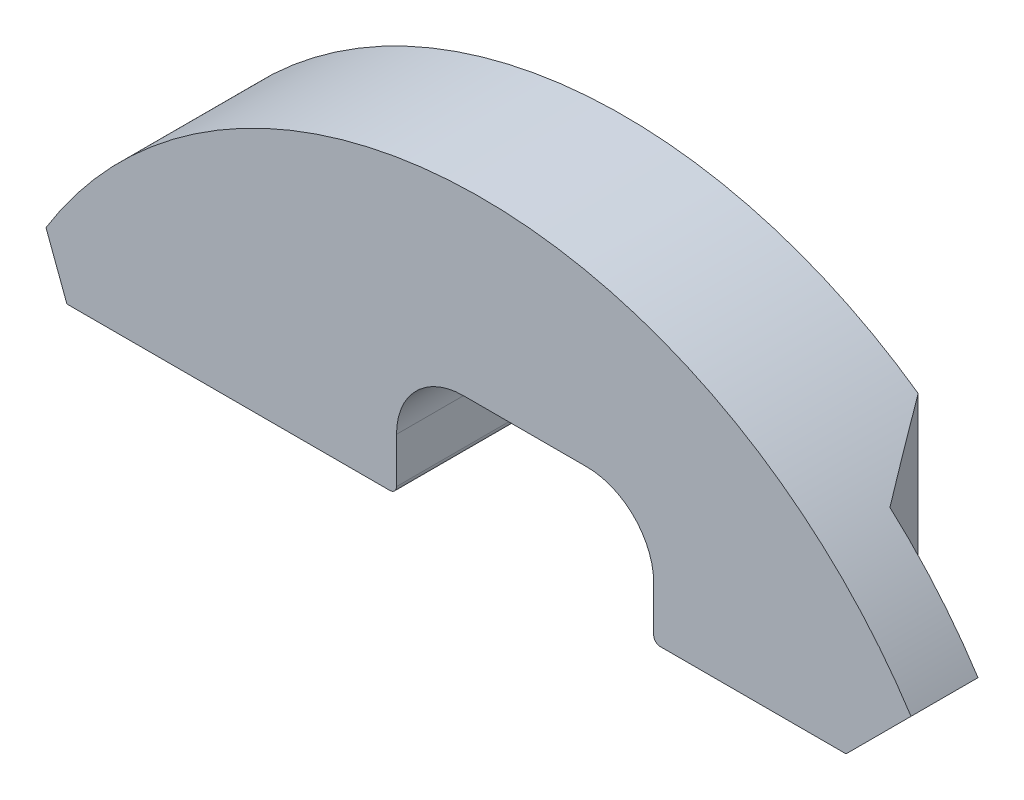
ISO-10303-21;
HEADER;
FILE_DESCRIPTION(('STEP AP214'),'2;1');
FILE_NAME('part.step','',(''),(''),'','','');
FILE_SCHEMA(('AUTOMOTIVE_DESIGN { 1 0 10303 214 1 1 1 1 }'));
ENDSEC;
DATA;
#1=APPLICATION_CONTEXT('core data for automotive mechanical design processes');
#2=APPLICATION_PROTOCOL_DEFINITION('international standard','automotive_design',2000,#1);
#3=PRODUCT_CONTEXT('',#1,'mechanical');
#4=PRODUCT('Part','Part','',(#3));
#5=PRODUCT_RELATED_PRODUCT_CATEGORY('part','',(#4));
#6=PRODUCT_DEFINITION_FORMATION('','',#4);
#7=PRODUCT_DEFINITION_CONTEXT('part definition',#1,'design');
#8=PRODUCT_DEFINITION('design','',#6,#7);
#9=PRODUCT_DEFINITION_SHAPE('','',#8);
#10=(LENGTH_UNIT() NAMED_UNIT(*) SI_UNIT(.MILLI.,.METRE.));
#11=(NAMED_UNIT(*) PLANE_ANGLE_UNIT() SI_UNIT($,.RADIAN.));
#12=(NAMED_UNIT(*) SI_UNIT($,.STERADIAN.) SOLID_ANGLE_UNIT());
#13=UNCERTAINTY_MEASURE_WITH_UNIT(LENGTH_MEASURE(1.E-05),#10,'distance_accuracy_value','');
#14=(GEOMETRIC_REPRESENTATION_CONTEXT(3) GLOBAL_UNCERTAINTY_ASSIGNED_CONTEXT((#13)) GLOBAL_UNIT_ASSIGNED_CONTEXT((#10,
#11,#12)) REPRESENTATION_CONTEXT('',''));
#15=CARTESIAN_POINT('',(0.,0.,0.));
#16=DIRECTION('',(0.,0.,1.));
#17=DIRECTION('',(1.,0.,0.));
#18=AXIS2_PLACEMENT_3D('',#15,#16,#17);
#19=CARTESIAN_POINT('',(48.768,0.,53.975));
#20=DIRECTION('',(0.,1.,0.));
#21=DIRECTION('',(-1.,0.,0.));
#22=AXIS2_PLACEMENT_3D('',#19,#20,#21);
#23=PLANE('',#22);
#24=DIRECTION('',(0.529998940003187,0.,0.847998304005083));
#25=VECTOR('',#24,1.);
#26=CARTESIAN_POINT('',(112.968558118522,0.,28.575000000001));
#27=LINE('',#26,#25);
#28=CARTESIAN_POINT('',(95.109183118521,0.,0.));
#29=VERTEX_POINT('',#28);
#30=CARTESIAN_POINT('',(112.968558118522,0.,28.575000000001));
#31=VERTEX_POINT('',#30);
#32=EDGE_CURVE('E140',#29,#31,#27,.T.);
#33=ORIENTED_EDGE('',*,*,#32,.T.);
#34=DIRECTION('',(1.,0.,0.));
#35=VECTOR('',#34,1.);
#36=CARTESIAN_POINT('',(163.768558118521,0.,28.575000000001));
#37=LINE('',#36,#35);
#38=CARTESIAN_POINT('',(121.717162921738,0.,28.575000000001));
#39=VERTEX_POINT('',#38);
#40=EDGE_CURVE('E143',#31,#39,#37,.T.);
#41=ORIENTED_EDGE('',*,*,#40,.T.);
#42=DIRECTION('',(0.,0.,1.));
#43=VECTOR('',#42,1.);
#44=CARTESIAN_POINT('',(121.717162921738,0.,53.975));
#45=LINE('',#44,#43);
#46=CARTESIAN_POINT('',(121.717162921738,0.,53.975));
#47=VERTEX_POINT('',#46);
#48=EDGE_CURVE('E228',#39,#47,#45,.T.);
#49=ORIENTED_EDGE('',*,*,#48,.T.);
#50=DIRECTION('',(1.,0.,0.));
#51=VECTOR('',#50,1.);
#52=CARTESIAN_POINT('',(48.768,0.,53.975));
#53=LINE('',#52,#51);
#54=CARTESIAN_POINT('',(51.308,0.,53.975));
#55=VERTEX_POINT('',#54);
#56=EDGE_CURVE('E170',#55,#47,#53,.T.);
#57=ORIENTED_EDGE('',*,*,#56,.F.);
#58=DIRECTION('',(0.,0.,-1.));
#59=VECTOR('',#58,1.);
#60=CARTESIAN_POINT('',(51.308,0.,53.975));
#61=LINE('',#60,#59);
#62=CARTESIAN_POINT('',(51.308,0.,0.));
#63=VERTEX_POINT('',#62);
#64=EDGE_CURVE('E221',#55,#63,#61,.T.);
#65=ORIENTED_EDGE('',*,*,#64,.T.);
#66=DIRECTION('',(1.,0.,0.));
#67=VECTOR('',#66,1.);
#68=CARTESIAN_POINT('',(48.768,0.,0.));
#69=LINE('',#68,#67);
#70=EDGE_CURVE('E153',#63,#29,#69,.T.);
#71=ORIENTED_EDGE('',*,*,#70,.T.);
#72=EDGE_LOOP('',(#33,#41,#49,#57,#65,#71));
#73=FACE_BOUND('',#72,.T.);
#74=ADVANCED_FACE('F34',(#73),#23,.F.);
#75=CARTESIAN_POINT('',(-16.5714418814787,-80.3119244999138,53.975));
#76=DIRECTION('',(0.,0.,-1.));
#77=DIRECTION('',(-1.,0.,0.));
#78=AXIS2_PLACEMENT_3D('',#75,#76,#77);
#79=CYLINDRICAL_SURFACE('',#78,193.811622771456);
#80=CARTESIAN_POINT('',(-16.5714418814787,-80.3119244999138,-178.688999999996));
#81=DIRECTION('',(0.847998304005083,0.,-0.529998940003187));
#82=DIRECTION('',(-0.529998940003187,0.,-0.847998304005083));
#83=AXIS2_PLACEMENT_3D('',#80,#81,#82);
#84=ELLIPSE('',#83,365.683038479833,193.811622771456);
#85=CARTESIAN_POINT('',(95.109183118521,78.0875171686561,0.));
#86=VERTEX_POINT('',#85);
#87=CARTESIAN_POINT('',(112.968558118522,63.848866012989,28.575000000001));
#88=VERTEX_POINT('',#87);
#89=EDGE_CURVE('E142',#86,#88,#84,.T.);
#90=ORIENTED_EDGE('',*,*,#89,.F.);
#91=CARTESIAN_POINT('',(-16.5714418814787,-80.3119244999138,0.));
#92=DIRECTION('',(0.,0.,1.));
#93=DIRECTION('',(-1.,0.,0.));
#94=AXIS2_PLACEMENT_3D('',#91,#92,#93);
#95=CIRCLE('',#94,193.811622771456);
#96=CARTESIAN_POINT('',(-181.700318552196,21.1543221576439,0.));
#97=VERTEX_POINT('',#96);
#98=EDGE_CURVE('E162',#86,#97,#95,.T.);
#99=ORIENTED_EDGE('',*,*,#98,.T.);
#100=DIRECTION('',(0.,0.,-1.));
#101=VECTOR('',#100,1.);
#102=CARTESIAN_POINT('',(-181.700318552196,21.1543221576439,53.975));
#103=LINE('',#102,#101);
#104=CARTESIAN_POINT('',(-181.700318552196,21.1543221576439,53.975));
#105=VERTEX_POINT('',#104);
#106=EDGE_CURVE('E58',#97,#105,#103,.F.);
#107=ORIENTED_EDGE('',*,*,#106,.T.);
#108=CARTESIAN_POINT('',(-16.5714418814787,-80.3119244999138,53.975));
#109=DIRECTION('',(0.,0.,1.));
#110=DIRECTION('',(-1.,0.,0.));
#111=AXIS2_PLACEMENT_3D('',#108,#109,#110);
#112=CIRCLE('',#111,193.811622771456);
#113=CARTESIAN_POINT('',(146.361471493222,24.6443085714839,53.975));
#114=VERTEX_POINT('',#113);
#115=EDGE_CURVE('E173',#114,#105,#112,.T.);
#116=ORIENTED_EDGE('',*,*,#115,.F.);
#117=DIRECTION('',(0.,0.,-1.));
#118=VECTOR('',#117,1.);
#119=CARTESIAN_POINT('',(146.361471493222,24.6443085714839,53.975));
#120=LINE('',#119,#118);
#121=CARTESIAN_POINT('',(146.361471493222,24.6443085714839,28.575000000001));
#122=VERTEX_POINT('',#121);
#123=EDGE_CURVE('E225',#114,#122,#120,.T.);
#124=ORIENTED_EDGE('',*,*,#123,.T.);
#125=CARTESIAN_POINT('',(-16.5714418814787,-80.3119244999138,28.575000000001));
#126=DIRECTION('',(0.,0.,-1.));
#127=DIRECTION('',(-1.,0.,0.));
#128=AXIS2_PLACEMENT_3D('',#125,#126,#127);
#129=CIRCLE('',#128,193.811622771456);
#130=EDGE_CURVE('E50',#88,#122,#129,.T.);
#131=ORIENTED_EDGE('',*,*,#130,.F.);
#132=EDGE_LOOP('',(#90,#99,#107,#116,#124,#131));
#133=FACE_BOUND('',#132,.T.);
#134=ADVANCED_FACE('F244',(#133),#79,.T.);
#135=CARTESIAN_POINT('',(-16.5714418814787,-80.3119244999138,0.));
#136=DIRECTION('',(0.,0.,-1.));
#137=DIRECTION('',(-1.,0.,0.));
#138=AXIS2_PLACEMENT_3D('',#135,#136,#137);
#139=PLANE('',#138);
#140=ORIENTED_EDGE('',*,*,#98,.F.);
#141=DIRECTION('',(0.,-1.,0.));
#142=VECTOR('',#141,1.);
#143=CARTESIAN_POINT('',(95.109183118521,-80.3119244999138,0.));
#144=LINE('',#143,#142);
#145=EDGE_CURVE('E11',#86,#29,#144,.T.);
#146=ORIENTED_EDGE('',*,*,#145,.T.);
#147=ORIENTED_EDGE('',*,*,#70,.F.);
#148=CARTESIAN_POINT('',(51.308,2.54,0.));
#149=DIRECTION('',(0.,0.,-1.));
#150=DIRECTION('',(-1.,0.,0.));
#151=AXIS2_PLACEMENT_3D('',#148,#149,#150);
#152=CIRCLE('',#151,2.54);
#153=CARTESIAN_POINT('',(48.768,2.54,0.));
#154=VERTEX_POINT('',#153);
#155=EDGE_CURVE('E209',#63,#154,#152,.T.);
#156=ORIENTED_EDGE('',*,*,#155,.T.);
#157=DIRECTION('',(0.,-1.,0.));
#158=VECTOR('',#157,1.);
#159=CARTESIAN_POINT('',(48.768,0.,0.));
#160=LINE('',#159,#158);
#161=CARTESIAN_POINT('',(48.768,19.706,0.));
#162=VERTEX_POINT('',#161);
#163=EDGE_CURVE('E182',#162,#154,#160,.T.);
#164=ORIENTED_EDGE('',*,*,#163,.F.);
#165=CARTESIAN_POINT('',(23.368,19.706,0.));
#166=DIRECTION('',(0.,0.,-1.));
#167=DIRECTION('',(-1.,0.,0.));
#168=AXIS2_PLACEMENT_3D('',#165,#166,#167);
#169=CIRCLE('',#168,25.4);
#170=CARTESIAN_POINT('',(23.368,45.1060000000001,0.));
#171=VERTEX_POINT('',#170);
#172=EDGE_CURVE('E197',#162,#171,#169,.F.);
#173=ORIENTED_EDGE('',*,*,#172,.T.);
#174=DIRECTION('',(1.,0.,0.));
#175=VECTOR('',#174,1.);
#176=CARTESIAN_POINT('',(-48.768,45.1060000000001,0.));
#177=LINE('',#176,#175);
#178=CARTESIAN_POINT('',(-23.368,45.1060000000001,0.));
#179=VERTEX_POINT('',#178);
#180=EDGE_CURVE('E179',#179,#171,#177,.T.);
#181=ORIENTED_EDGE('',*,*,#180,.F.);
#182=CARTESIAN_POINT('',(-23.368,19.706,0.));
#183=DIRECTION('',(0.,0.,-1.));
#184=DIRECTION('',(-1.,0.,0.));
#185=AXIS2_PLACEMENT_3D('',#182,#183,#184);
#186=CIRCLE('',#185,25.4);
#187=CARTESIAN_POINT('',(-48.768,19.706,0.));
#188=VERTEX_POINT('',#187);
#189=EDGE_CURVE('E201',#179,#188,#186,.F.);
#190=ORIENTED_EDGE('',*,*,#189,.T.);
#191=DIRECTION('',(0.,1.,0.));
#192=VECTOR('',#191,1.);
#193=CARTESIAN_POINT('',(-48.768,0.,0.));
#194=LINE('',#193,#192);
#195=CARTESIAN_POINT('',(-48.768,2.54,0.));
#196=VERTEX_POINT('',#195);
#197=EDGE_CURVE('E177',#196,#188,#194,.T.);
#198=ORIENTED_EDGE('',*,*,#197,.F.);
#199=CARTESIAN_POINT('',(-51.308,2.54,0.));
#200=DIRECTION('',(0.,0.,-1.));
#201=DIRECTION('',(-1.,0.,0.));
#202=AXIS2_PLACEMENT_3D('',#199,#200,#201);
#203=CIRCLE('',#202,2.54);
#204=CARTESIAN_POINT('',(-51.308,0.,0.));
#205=VERTEX_POINT('',#204);
#206=EDGE_CURVE('E211',#196,#205,#203,.T.);
#207=ORIENTED_EDGE('',*,*,#206,.T.);
#208=DIRECTION('',(1.,0.,0.));
#209=VECTOR('',#208,1.);
#210=CARTESIAN_POINT('',(-48.768,0.,0.));
#211=LINE('',#210,#209);
#212=CARTESIAN_POINT('',(-173.782777234729,0.,0.));
#213=VERTEX_POINT('',#212);
#214=EDGE_CURVE('E158',#213,#205,#211,.T.);
#215=ORIENTED_EDGE('',*,*,#214,.F.);
#216=DIRECTION('',(0.350528369686415,-0.936552113897024,0.));
#217=VECTOR('',#216,1.);
#218=CARTESIAN_POINT('',(-128.100750825996,-122.054595576595,0.));
#219=LINE('',#218,#217);
#220=EDGE_CURVE('E235',#213,#97,#219,.F.);
#221=ORIENTED_EDGE('',*,*,#220,.T.);
#222=EDGE_LOOP('',(#140,#146,#147,#156,#164,#173,#181,#190,#198,#207,#215,#221));
#223=FACE_BOUND('',#222,.T.);
#224=ADVANCED_FACE('F256',(#223),#139,.T.);
#225=CARTESIAN_POINT('',(146.361471493222,24.6443085714839,53.975));
#226=DIRECTION('',(-0.707106781186546,0.707106781186549,0.));
#227=DIRECTION('',(0.,0.,-1.));
#228=AXIS2_PLACEMENT_3D('',#225,#226,#227);
#229=PLANE('',#228);
#230=ORIENTED_EDGE('',*,*,#48,.F.);
#231=DIRECTION('',(-0.707106781186549,-0.707106781186546,0.));
#232=VECTOR('',#231,1.);
#233=CARTESIAN_POINT('',(146.361471493222,24.6443085714839,28.575000000001));
#234=LINE('',#233,#232);
#235=EDGE_CURVE('E43',#39,#122,#234,.F.);
#236=ORIENTED_EDGE('',*,*,#235,.T.);
#237=ORIENTED_EDGE('',*,*,#123,.F.);
#238=DIRECTION('',(-0.707106781186549,-0.707106781186546,0.));
#239=VECTOR('',#238,1.);
#240=CARTESIAN_POINT('',(146.361471493222,24.6443085714839,53.975));
#241=LINE('',#240,#239);
#242=EDGE_CURVE('E230',#47,#114,#241,.F.);
#243=ORIENTED_EDGE('',*,*,#242,.F.);
#244=EDGE_LOOP('',(#230,#236,#237,#243));
#245=FACE_BOUND('',#244,.T.);
#246=ADVANCED_FACE('F242',(#245),#229,.F.);
#247=CARTESIAN_POINT('',(-48.768,0.,53.975));
#248=DIRECTION('',(0.,1.,0.));
#249=DIRECTION('',(-1.,0.,0.));
#250=AXIS2_PLACEMENT_3D('',#247,#248,#249);
#251=PLANE('',#250);
#252=DIRECTION('',(1.,0.,0.));
#253=VECTOR('',#252,1.);
#254=CARTESIAN_POINT('',(-48.768,0.,53.975));
#255=LINE('',#254,#253);
#256=CARTESIAN_POINT('',(-173.782777234729,0.,53.975));
#257=VERTEX_POINT('',#256);
#258=CARTESIAN_POINT('',(-51.308,0.,53.975));
#259=VERTEX_POINT('',#258);
#260=EDGE_CURVE('E159',#257,#259,#255,.T.);
#261=ORIENTED_EDGE('',*,*,#260,.F.);
#262=DIRECTION('',(0.,0.,-1.));
#263=VECTOR('',#262,1.);
#264=CARTESIAN_POINT('',(-173.782777234729,0.,53.975));
#265=LINE('',#264,#263);
#266=EDGE_CURVE('E232',#257,#213,#265,.T.);
#267=ORIENTED_EDGE('',*,*,#266,.T.);
#268=ORIENTED_EDGE('',*,*,#214,.T.);
#269=DIRECTION('',(0.,0.,-1.));
#270=VECTOR('',#269,1.);
#271=CARTESIAN_POINT('',(-51.308,0.,53.975));
#272=LINE('',#271,#270);
#273=EDGE_CURVE('E214',#205,#259,#272,.F.);
#274=ORIENTED_EDGE('',*,*,#273,.T.);
#275=EDGE_LOOP('',(#261,#267,#268,#274));
#276=FACE_BOUND('',#275,.T.);
#277=ADVANCED_FACE('F253',(#276),#251,.F.);
#278=CARTESIAN_POINT('',(-48.768,0.,53.975));
#279=DIRECTION('',(-1.,0.,0.));
#280=DIRECTION('',(0.,0.,1.));
#281=AXIS2_PLACEMENT_3D('',#278,#279,#280);
#282=PLANE('',#281);
#283=DIRECTION('',(0.,1.,0.));
#284=VECTOR('',#283,1.);
#285=CARTESIAN_POINT('',(-48.768,0.,53.975));
#286=LINE('',#285,#284);
#287=CARTESIAN_POINT('',(-48.768,2.54,53.975));
#288=VERTEX_POINT('',#287);
#289=CARTESIAN_POINT('',(-48.768,19.706,53.975));
#290=VERTEX_POINT('',#289);
#291=EDGE_CURVE('E161',#288,#290,#286,.T.);
#292=ORIENTED_EDGE('',*,*,#291,.F.);
#293=DIRECTION('',(0.,0.,-1.));
#294=VECTOR('',#293,1.);
#295=CARTESIAN_POINT('',(-48.768,2.54,53.975));
#296=LINE('',#295,#294);
#297=EDGE_CURVE('E206',#288,#196,#296,.T.);
#298=ORIENTED_EDGE('',*,*,#297,.T.);
#299=ORIENTED_EDGE('',*,*,#197,.T.);
#300=DIRECTION('',(0.,0.,-1.));
#301=VECTOR('',#300,1.);
#302=CARTESIAN_POINT('',(-48.768,19.706,53.975));
#303=LINE('',#302,#301);
#304=EDGE_CURVE('E194',#188,#290,#303,.F.);
#305=ORIENTED_EDGE('',*,*,#304,.T.);
#306=EDGE_LOOP('',(#292,#298,#299,#305));
#307=FACE_BOUND('',#306,.T.);
#308=ADVANCED_FACE('F265',(#307),#282,.F.);
#309=CARTESIAN_POINT('',(-48.768,45.1060000000001,53.975));
#310=DIRECTION('',(0.,1.,0.));
#311=DIRECTION('',(0.,0.,1.));
#312=AXIS2_PLACEMENT_3D('',#309,#310,#311);
#313=PLANE('',#312);
#314=ORIENTED_EDGE('',*,*,#180,.T.);
#315=DIRECTION('',(0.,0.,-1.));
#316=VECTOR('',#315,1.);
#317=CARTESIAN_POINT('',(23.368,45.1060000000001,53.975));
#318=LINE('',#317,#316);
#319=CARTESIAN_POINT('',(23.368,45.1060000000001,53.975));
#320=VERTEX_POINT('',#319);
#321=EDGE_CURVE('E192',#171,#320,#318,.F.);
#322=ORIENTED_EDGE('',*,*,#321,.T.);
#323=DIRECTION('',(1.,0.,0.));
#324=VECTOR('',#323,1.);
#325=CARTESIAN_POINT('',(-48.768,45.1060000000001,53.975));
#326=LINE('',#325,#324);
#327=CARTESIAN_POINT('',(-23.368,45.1060000000001,53.975));
#328=VERTEX_POINT('',#327);
#329=EDGE_CURVE('E164',#328,#320,#326,.T.);
#330=ORIENTED_EDGE('',*,*,#329,.F.);
#331=DIRECTION('',(0.,0.,-1.));
#332=VECTOR('',#331,1.);
#333=CARTESIAN_POINT('',(-23.368,45.1060000000001,0.));
#334=LINE('',#333,#332);
#335=EDGE_CURVE('E189',#328,#179,#334,.T.);
#336=ORIENTED_EDGE('',*,*,#335,.T.);
#337=EDGE_LOOP('',(#314,#322,#330,#336));
#338=FACE_BOUND('',#337,.T.);
#339=ADVANCED_FACE('F274',(#338),#313,.F.);
#340=CARTESIAN_POINT('',(48.768,0.,53.975));
#341=DIRECTION('',(1.,0.,0.));
#342=DIRECTION('',(0.,0.,-1.));
#343=AXIS2_PLACEMENT_3D('',#340,#341,#342);
#344=PLANE('',#343);
#345=ORIENTED_EDGE('',*,*,#163,.T.);
#346=DIRECTION('',(0.,0.,-1.));
#347=VECTOR('',#346,1.);
#348=CARTESIAN_POINT('',(48.768,2.54,53.975));
#349=LINE('',#348,#347);
#350=CARTESIAN_POINT('',(48.768,2.54,53.975));
#351=VERTEX_POINT('',#350);
#352=EDGE_CURVE('E223',#154,#351,#349,.F.);
#353=ORIENTED_EDGE('',*,*,#352,.T.);
#354=DIRECTION('',(0.,-1.,0.));
#355=VECTOR('',#354,1.);
#356=CARTESIAN_POINT('',(48.768,0.,53.975));
#357=LINE('',#356,#355);
#358=CARTESIAN_POINT('',(48.768,19.706,53.975));
#359=VERTEX_POINT('',#358);
#360=EDGE_CURVE('E167',#359,#351,#357,.T.);
#361=ORIENTED_EDGE('',*,*,#360,.F.);
#362=DIRECTION('',(0.,0.,-1.));
#363=VECTOR('',#362,1.);
#364=CARTESIAN_POINT('',(48.768,19.706,0.));
#365=LINE('',#364,#363);
#366=EDGE_CURVE('E175',#359,#162,#365,.T.);
#367=ORIENTED_EDGE('',*,*,#366,.T.);
#368=EDGE_LOOP('',(#345,#353,#361,#367));
#369=FACE_BOUND('',#368,.T.);
#370=ADVANCED_FACE('F283',(#369),#344,.F.);
#371=CARTESIAN_POINT('',(-16.5714418814787,-80.3119244999138,53.975));
#372=DIRECTION('',(0.,0.,-1.));
#373=DIRECTION('',(-1.,0.,0.));
#374=AXIS2_PLACEMENT_3D('',#371,#372,#373);
#375=PLANE('',#374);
#376=ORIENTED_EDGE('',*,*,#115,.T.);
#377=DIRECTION('',(-0.350528369686415,0.936552113897024,0.));
#378=VECTOR('',#377,1.);
#379=CARTESIAN_POINT('',(-173.782777234729,0.,53.975));
#380=LINE('',#379,#378);
#381=EDGE_CURVE('E239',#105,#257,#380,.F.);
#382=ORIENTED_EDGE('',*,*,#381,.T.);
#383=ORIENTED_EDGE('',*,*,#260,.T.);
#384=CARTESIAN_POINT('',(-51.308,2.54,53.975));
#385=DIRECTION('',(0.,0.,-1.));
#386=DIRECTION('',(-1.,0.,0.));
#387=AXIS2_PLACEMENT_3D('',#384,#385,#386);
#388=CIRCLE('',#387,2.54);
#389=EDGE_CURVE('E219',#259,#288,#388,.F.);
#390=ORIENTED_EDGE('',*,*,#389,.T.);
#391=ORIENTED_EDGE('',*,*,#291,.T.);
#392=CARTESIAN_POINT('',(-23.368,19.706,53.975));
#393=DIRECTION('',(0.,0.,-1.));
#394=DIRECTION('',(-1.,0.,0.));
#395=AXIS2_PLACEMENT_3D('',#392,#393,#394);
#396=CIRCLE('',#395,25.4);
#397=EDGE_CURVE('E204',#290,#328,#396,.T.);
#398=ORIENTED_EDGE('',*,*,#397,.T.);
#399=ORIENTED_EDGE('',*,*,#329,.T.);
#400=CARTESIAN_POINT('',(23.368,19.706,53.975));
#401=DIRECTION('',(0.,0.,-1.));
#402=DIRECTION('',(-1.,0.,0.));
#403=AXIS2_PLACEMENT_3D('',#400,#401,#402);
#404=CIRCLE('',#403,25.4);
#405=EDGE_CURVE('E199',#320,#359,#404,.T.);
#406=ORIENTED_EDGE('',*,*,#405,.T.);
#407=ORIENTED_EDGE('',*,*,#360,.T.);
#408=CARTESIAN_POINT('',(51.308,2.54,53.975));
#409=DIRECTION('',(0.,0.,-1.));
#410=DIRECTION('',(-1.,0.,0.));
#411=AXIS2_PLACEMENT_3D('',#408,#409,#410);
#412=CIRCLE('',#411,2.54);
#413=EDGE_CURVE('E217',#351,#55,#412,.F.);
#414=ORIENTED_EDGE('',*,*,#413,.T.);
#415=ORIENTED_EDGE('',*,*,#56,.T.);
#416=ORIENTED_EDGE('',*,*,#242,.T.);
#417=EDGE_LOOP('',(#376,#382,#383,#390,#391,#398,#399,#406,#407,#414,#415,#416));
#418=FACE_BOUND('',#417,.T.);
#419=ADVANCED_FACE('F247',(#418),#375,.F.);
#420=CARTESIAN_POINT('',(23.368,19.706,53.975));
#421=DIRECTION('',(0.,0.,1.));
#422=DIRECTION('',(1.,0.,0.));
#423=AXIS2_PLACEMENT_3D('',#420,#421,#422);
#424=CYLINDRICAL_SURFACE('',#423,25.4);
#425=ORIENTED_EDGE('',*,*,#405,.F.);
#426=ORIENTED_EDGE('',*,*,#321,.F.);
#427=ORIENTED_EDGE('',*,*,#172,.F.);
#428=ORIENTED_EDGE('',*,*,#366,.F.);
#429=EDGE_LOOP('',(#425,#426,#427,#428));
#430=FACE_BOUND('',#429,.T.);
#431=ADVANCED_FACE('F278',(#430),#424,.F.);
#432=CARTESIAN_POINT('',(-23.368,19.706,53.975));
#433=DIRECTION('',(0.,0.,1.));
#434=DIRECTION('',(1.,0.,0.));
#435=AXIS2_PLACEMENT_3D('',#432,#433,#434);
#436=CYLINDRICAL_SURFACE('',#435,25.4);
#437=ORIENTED_EDGE('',*,*,#397,.F.);
#438=ORIENTED_EDGE('',*,*,#304,.F.);
#439=ORIENTED_EDGE('',*,*,#189,.F.);
#440=ORIENTED_EDGE('',*,*,#335,.F.);
#441=EDGE_LOOP('',(#437,#438,#439,#440));
#442=FACE_BOUND('',#441,.T.);
#443=ADVANCED_FACE('F270',(#442),#436,.F.);
#444=CARTESIAN_POINT('',(-51.308,2.54,53.975));
#445=DIRECTION('',(0.,0.,-1.));
#446=DIRECTION('',(-1.,0.,0.));
#447=AXIS2_PLACEMENT_3D('',#444,#445,#446);
#448=CYLINDRICAL_SURFACE('',#447,2.54);
#449=ORIENTED_EDGE('',*,*,#389,.F.);
#450=ORIENTED_EDGE('',*,*,#273,.F.);
#451=ORIENTED_EDGE('',*,*,#206,.F.);
#452=ORIENTED_EDGE('',*,*,#297,.F.);
#453=EDGE_LOOP('',(#449,#450,#451,#452));
#454=FACE_BOUND('',#453,.T.);
#455=ADVANCED_FACE('F262',(#454),#448,.T.);
#456=CARTESIAN_POINT('',(51.308,2.54,53.975));
#457=DIRECTION('',(0.,0.,-1.));
#458=DIRECTION('',(-1.,0.,0.));
#459=AXIS2_PLACEMENT_3D('',#456,#457,#458);
#460=CYLINDRICAL_SURFACE('',#459,2.54);
#461=ORIENTED_EDGE('',*,*,#413,.F.);
#462=ORIENTED_EDGE('',*,*,#352,.F.);
#463=ORIENTED_EDGE('',*,*,#155,.F.);
#464=ORIENTED_EDGE('',*,*,#64,.F.);
#465=EDGE_LOOP('',(#461,#462,#463,#464));
#466=FACE_BOUND('',#465,.T.);
#467=ADVANCED_FACE('F287',(#466),#460,.T.);
#468=CARTESIAN_POINT('',(-173.782777234729,0.,53.975));
#469=DIRECTION('',(0.936552113897024,0.350528369686415,0.));
#470=DIRECTION('',(0.,0.,-1.));
#471=AXIS2_PLACEMENT_3D('',#468,#469,#470);
#472=PLANE('',#471);
#473=ORIENTED_EDGE('',*,*,#381,.F.);
#474=ORIENTED_EDGE('',*,*,#106,.F.);
#475=ORIENTED_EDGE('',*,*,#220,.F.);
#476=ORIENTED_EDGE('',*,*,#266,.F.);
#477=EDGE_LOOP('',(#473,#474,#475,#476));
#478=FACE_BOUND('',#477,.T.);
#479=ADVANCED_FACE('F37',(#478),#472,.F.);
#480=CARTESIAN_POINT('',(112.968558118522,113.499698271542,28.575000000001));
#481=DIRECTION('',(0.847998304005083,0.,-0.529998940003187));
#482=DIRECTION('',(-0.529998940003187,0.,-0.847998304005083));
#483=AXIS2_PLACEMENT_3D('',#480,#481,#482);
#484=PLANE('',#483);
#485=ORIENTED_EDGE('',*,*,#89,.T.);
#486=DIRECTION('',(0.,-1.,0.));
#487=VECTOR('',#486,1.);
#488=CARTESIAN_POINT('',(112.968558118522,113.499698271542,28.575000000001));
#489=LINE('',#488,#487);
#490=EDGE_CURVE('E136',#88,#31,#489,.T.);
#491=ORIENTED_EDGE('',*,*,#490,.T.);
#492=ORIENTED_EDGE('',*,*,#32,.F.);
#493=ORIENTED_EDGE('',*,*,#145,.F.);
#494=EDGE_LOOP('',(#485,#491,#492,#493));
#495=FACE_BOUND('',#494,.T.);
#496=ADVANCED_FACE('F138',(#495),#484,.T.);
#497=CARTESIAN_POINT('',(163.768558118521,113.499698271542,28.575000000001));
#498=DIRECTION('',(0.,0.,-1.));
#499=DIRECTION('',(-1.,0.,0.));
#500=AXIS2_PLACEMENT_3D('',#497,#498,#499);
#501=PLANE('',#500);
#502=ORIENTED_EDGE('',*,*,#130,.T.);
#503=ORIENTED_EDGE('',*,*,#235,.F.);
#504=ORIENTED_EDGE('',*,*,#40,.F.);
#505=ORIENTED_EDGE('',*,*,#490,.F.);
#506=EDGE_LOOP('',(#502,#503,#504,#505));
#507=FACE_BOUND('',#506,.T.);
#508=ADVANCED_FACE('F146',(#507),#501,.T.);
#509=CLOSED_SHELL('',(#74,#134,#224,#246,#277,#308,#339,#370,#419,#431,#443,#455,#467,#479,#496,#508));
#510=MANIFOLD_SOLID_BREP('B2',#509);
#511=ADVANCED_BREP_SHAPE_REPRESENTATION('',(#18,#510),#14);
#512=SHAPE_DEFINITION_REPRESENTATION(#9,#511);
ENDSEC;
END-ISO-10303-21;
